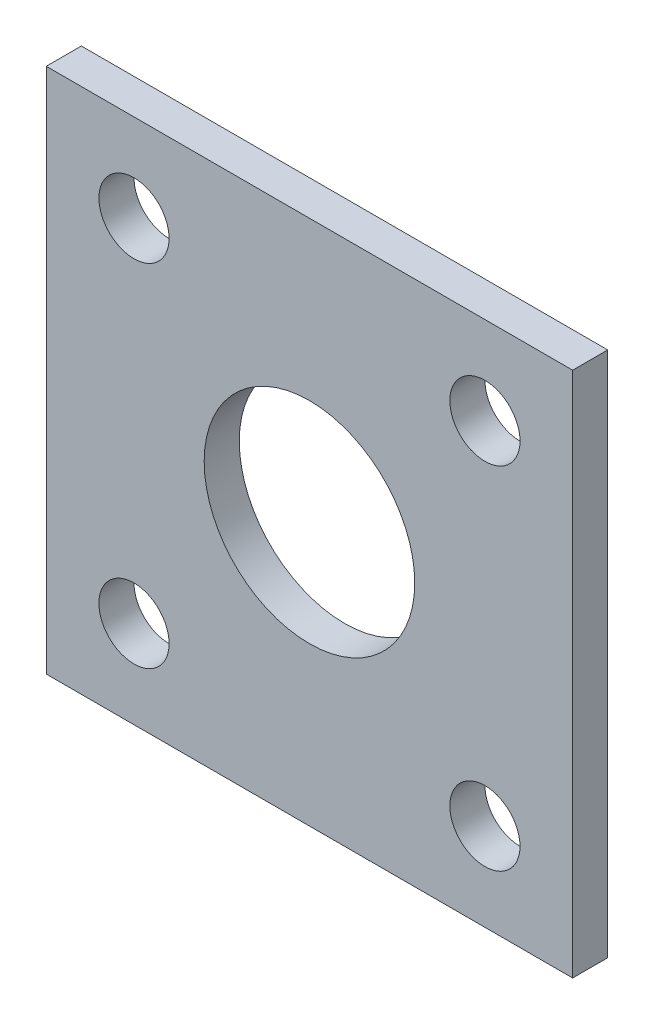
ISO-10303-21;
HEADER;
FILE_DESCRIPTION(('STEP AP214'),'2;1');
FILE_NAME('part.step','',(''),(''),'','','');
FILE_SCHEMA(('AUTOMOTIVE_DESIGN { 1 0 10303 214 1 1 1 1 }'));
ENDSEC;
DATA;
#1=APPLICATION_CONTEXT('core data for automotive mechanical design processes');
#2=APPLICATION_PROTOCOL_DEFINITION('international standard','automotive_design',2000,#1);
#3=PRODUCT_CONTEXT('',#1,'mechanical');
#4=PRODUCT('Part','Part','',(#3));
#5=PRODUCT_RELATED_PRODUCT_CATEGORY('part','',(#4));
#6=PRODUCT_DEFINITION_FORMATION('','',#4);
#7=PRODUCT_DEFINITION_CONTEXT('part definition',#1,'design');
#8=PRODUCT_DEFINITION('design','',#6,#7);
#9=PRODUCT_DEFINITION_SHAPE('','',#8);
#10=(LENGTH_UNIT() NAMED_UNIT(*) SI_UNIT(.MILLI.,.METRE.));
#11=(NAMED_UNIT(*) PLANE_ANGLE_UNIT() SI_UNIT($,.RADIAN.));
#12=(NAMED_UNIT(*) SI_UNIT($,.STERADIAN.) SOLID_ANGLE_UNIT());
#13=UNCERTAINTY_MEASURE_WITH_UNIT(LENGTH_MEASURE(1.E-05),#10,'distance_accuracy_value','');
#14=(GEOMETRIC_REPRESENTATION_CONTEXT(3) GLOBAL_UNCERTAINTY_ASSIGNED_CONTEXT((#13)) GLOBAL_UNIT_ASSIGNED_CONTEXT((#10,
#11,#12)) REPRESENTATION_CONTEXT('',''));
#15=CARTESIAN_POINT('',(0.,0.,0.));
#16=DIRECTION('',(0.,0.,1.));
#17=DIRECTION('',(1.,0.,0.));
#18=AXIS2_PLACEMENT_3D('',#15,#16,#17);
#19=CARTESIAN_POINT('',(0.,0.,100.));
#20=DIRECTION('',(0.,0.,1.));
#21=DIRECTION('',(1.,0.,0.));
#22=AXIS2_PLACEMENT_3D('',#19,#20,#21);
#23=PLANE('',#22);
#24=CARTESIAN_POINT('',(500.,-500.,100.));
#25=DIRECTION('',(0.,0.,1.));
#26=DIRECTION('',(1.,0.,0.));
#27=AXIS2_PLACEMENT_3D('',#24,#25,#26);
#28=CIRCLE('',#27,100.);
#29=CARTESIAN_POINT('',(600.,-500.,100.));
#30=VERTEX_POINT('',#29);
#31=EDGE_CURVE('E127',#30,#30,#28,.T.);
#32=ORIENTED_EDGE('',*,*,#31,.F.);
#33=EDGE_LOOP('',(#32));
#34=FACE_BOUND('',#33,.T.);
#35=CARTESIAN_POINT('',(-500.,500.,100.));
#36=DIRECTION('',(0.,0.,1.));
#37=DIRECTION('',(1.,0.,0.));
#38=AXIS2_PLACEMENT_3D('',#35,#36,#37);
#39=CIRCLE('',#38,100.);
#40=CARTESIAN_POINT('',(-400.,500.,100.));
#41=VERTEX_POINT('',#40);
#42=EDGE_CURVE('E115',#41,#41,#39,.T.);
#43=ORIENTED_EDGE('',*,*,#42,.F.);
#44=EDGE_LOOP('',(#43));
#45=FACE_BOUND('',#44,.T.);
#46=DIRECTION('',(0.,1.,0.));
#47=VECTOR('',#46,1.);
#48=CARTESIAN_POINT('',(750.,750.,100.));
#49=LINE('',#48,#47);
#50=CARTESIAN_POINT('',(750.,-750.,100.));
#51=VERTEX_POINT('',#50);
#52=CARTESIAN_POINT('',(750.,750.,100.));
#53=VERTEX_POINT('',#52);
#54=EDGE_CURVE('E85',#51,#53,#49,.T.);
#55=ORIENTED_EDGE('',*,*,#54,.T.);
#56=DIRECTION('',(-1.,0.,0.));
#57=VECTOR('',#56,1.);
#58=CARTESIAN_POINT('',(-750.,750.,100.));
#59=LINE('',#58,#57);
#60=CARTESIAN_POINT('',(-750.,750.,100.));
#61=VERTEX_POINT('',#60);
#62=EDGE_CURVE('E80',#53,#61,#59,.T.);
#63=ORIENTED_EDGE('',*,*,#62,.T.);
#64=DIRECTION('',(0.,-1.,0.));
#65=VECTOR('',#64,1.);
#66=CARTESIAN_POINT('',(-750.,750.,100.));
#67=LINE('',#66,#65);
#68=CARTESIAN_POINT('',(-750.,-750.,100.));
#69=VERTEX_POINT('',#68);
#70=EDGE_CURVE('E83',#61,#69,#67,.T.);
#71=ORIENTED_EDGE('',*,*,#70,.T.);
#72=DIRECTION('',(1.,0.,0.));
#73=VECTOR('',#72,1.);
#74=CARTESIAN_POINT('',(-750.,-750.,100.));
#75=LINE('',#74,#73);
#76=EDGE_CURVE('E50',#69,#51,#75,.T.);
#77=ORIENTED_EDGE('',*,*,#76,.T.);
#78=EDGE_LOOP('',(#55,#63,#71,#77));
#79=FACE_BOUND('',#78,.T.);
#80=CARTESIAN_POINT('',(0.,0.,100.));
#81=DIRECTION('',(0.,0.,1.));
#82=DIRECTION('',(1.,0.,0.));
#83=AXIS2_PLACEMENT_3D('',#80,#81,#82);
#84=CIRCLE('',#83,300.);
#85=CARTESIAN_POINT('',(300.,0.,100.));
#86=VERTEX_POINT('',#85);
#87=EDGE_CURVE('E100',#86,#86,#84,.T.);
#88=ORIENTED_EDGE('',*,*,#87,.F.);
#89=EDGE_LOOP('',(#88));
#90=FACE_BOUND('',#89,.T.);
#91=CARTESIAN_POINT('',(500.,500.,100.));
#92=DIRECTION('',(0.,0.,1.));
#93=DIRECTION('',(1.,0.,0.));
#94=AXIS2_PLACEMENT_3D('',#91,#92,#93);
#95=CIRCLE('',#94,100.);
#96=CARTESIAN_POINT('',(600.,500.,100.));
#97=VERTEX_POINT('',#96);
#98=EDGE_CURVE('E121',#97,#97,#95,.T.);
#99=ORIENTED_EDGE('',*,*,#98,.F.);
#100=EDGE_LOOP('',(#99));
#101=FACE_BOUND('',#100,.T.);
#102=CARTESIAN_POINT('',(-500.,-500.,100.));
#103=DIRECTION('',(0.,0.,1.));
#104=DIRECTION('',(1.,0.,0.));
#105=AXIS2_PLACEMENT_3D('',#102,#103,#104);
#106=CIRCLE('',#105,100.);
#107=CARTESIAN_POINT('',(-400.,-500.,100.));
#108=VERTEX_POINT('',#107);
#109=EDGE_CURVE('E133',#108,#108,#106,.T.);
#110=ORIENTED_EDGE('',*,*,#109,.F.);
#111=EDGE_LOOP('',(#110));
#112=FACE_BOUND('',#111,.T.);
#113=ADVANCED_FACE('F33',(#34,#45,#79,#90,#101,#112),#23,.T.);
#114=CARTESIAN_POINT('',(0.,0.,0.));
#115=DIRECTION('',(0.,0.,1.));
#116=DIRECTION('',(1.,0.,0.));
#117=AXIS2_PLACEMENT_3D('',#114,#115,#116);
#118=PLANE('',#117);
#119=DIRECTION('',(0.,1.,0.));
#120=VECTOR('',#119,1.);
#121=CARTESIAN_POINT('',(750.,750.,0.));
#122=LINE('',#121,#120);
#123=CARTESIAN_POINT('',(750.,-750.,0.));
#124=VERTEX_POINT('',#123);
#125=CARTESIAN_POINT('',(750.,750.,0.));
#126=VERTEX_POINT('',#125);
#127=EDGE_CURVE('E97',#124,#126,#122,.T.);
#128=ORIENTED_EDGE('',*,*,#127,.F.);
#129=DIRECTION('',(1.,0.,0.));
#130=VECTOR('',#129,1.);
#131=CARTESIAN_POINT('',(-750.,-750.,0.));
#132=LINE('',#131,#130);
#133=CARTESIAN_POINT('',(-750.,-750.,0.));
#134=VERTEX_POINT('',#133);
#135=EDGE_CURVE('E73',#134,#124,#132,.T.);
#136=ORIENTED_EDGE('',*,*,#135,.F.);
#137=DIRECTION('',(0.,-1.,0.));
#138=VECTOR('',#137,1.);
#139=CARTESIAN_POINT('',(-750.,750.,0.));
#140=LINE('',#139,#138);
#141=CARTESIAN_POINT('',(-750.,750.,0.));
#142=VERTEX_POINT('',#141);
#143=EDGE_CURVE('E67',#142,#134,#140,.T.);
#144=ORIENTED_EDGE('',*,*,#143,.F.);
#145=DIRECTION('',(-1.,0.,0.));
#146=VECTOR('',#145,1.);
#147=CARTESIAN_POINT('',(-750.,750.,0.));
#148=LINE('',#147,#146);
#149=EDGE_CURVE('E89',#126,#142,#148,.T.);
#150=ORIENTED_EDGE('',*,*,#149,.F.);
#151=EDGE_LOOP('',(#128,#136,#144,#150));
#152=FACE_BOUND('',#151,.T.);
#153=CARTESIAN_POINT('',(0.,0.,0.));
#154=DIRECTION('',(0.,0.,1.));
#155=DIRECTION('',(1.,0.,0.));
#156=AXIS2_PLACEMENT_3D('',#153,#154,#155);
#157=CIRCLE('',#156,300.);
#158=CARTESIAN_POINT('',(300.,0.,0.));
#159=VERTEX_POINT('',#158);
#160=EDGE_CURVE('E112',#159,#159,#157,.T.);
#161=ORIENTED_EDGE('',*,*,#160,.T.);
#162=EDGE_LOOP('',(#161));
#163=FACE_BOUND('',#162,.T.);
#164=CARTESIAN_POINT('',(-500.,500.,0.));
#165=DIRECTION('',(0.,0.,1.));
#166=DIRECTION('',(1.,0.,0.));
#167=AXIS2_PLACEMENT_3D('',#164,#165,#166);
#168=CIRCLE('',#167,100.);
#169=CARTESIAN_POINT('',(-400.,500.,0.));
#170=VERTEX_POINT('',#169);
#171=EDGE_CURVE('E118',#170,#170,#168,.T.);
#172=ORIENTED_EDGE('',*,*,#171,.T.);
#173=EDGE_LOOP('',(#172));
#174=FACE_BOUND('',#173,.T.);
#175=CARTESIAN_POINT('',(500.,500.,0.));
#176=DIRECTION('',(0.,0.,1.));
#177=DIRECTION('',(1.,0.,0.));
#178=AXIS2_PLACEMENT_3D('',#175,#176,#177);
#179=CIRCLE('',#178,100.);
#180=CARTESIAN_POINT('',(600.,500.,0.));
#181=VERTEX_POINT('',#180);
#182=EDGE_CURVE('E124',#181,#181,#179,.T.);
#183=ORIENTED_EDGE('',*,*,#182,.T.);
#184=EDGE_LOOP('',(#183));
#185=FACE_BOUND('',#184,.T.);
#186=CARTESIAN_POINT('',(500.,-500.,0.));
#187=DIRECTION('',(0.,0.,1.));
#188=DIRECTION('',(1.,0.,0.));
#189=AXIS2_PLACEMENT_3D('',#186,#187,#188);
#190=CIRCLE('',#189,100.);
#191=CARTESIAN_POINT('',(600.,-500.,0.));
#192=VERTEX_POINT('',#191);
#193=EDGE_CURVE('E130',#192,#192,#190,.T.);
#194=ORIENTED_EDGE('',*,*,#193,.T.);
#195=EDGE_LOOP('',(#194));
#196=FACE_BOUND('',#195,.T.);
#197=CARTESIAN_POINT('',(-500.,-500.,0.));
#198=DIRECTION('',(0.,0.,1.));
#199=DIRECTION('',(1.,0.,0.));
#200=AXIS2_PLACEMENT_3D('',#197,#198,#199);
#201=CIRCLE('',#200,100.);
#202=CARTESIAN_POINT('',(-400.,-500.,0.));
#203=VERTEX_POINT('',#202);
#204=EDGE_CURVE('E136',#203,#203,#201,.T.);
#205=ORIENTED_EDGE('',*,*,#204,.T.);
#206=EDGE_LOOP('',(#205));
#207=FACE_BOUND('',#206,.T.);
#208=ADVANCED_FACE('F108',(#152,#163,#174,#185,#196,#207),#118,.F.);
#209=CARTESIAN_POINT('',(750.,750.,100.));
#210=DIRECTION('',(-1.,0.,0.));
#211=DIRECTION('',(0.,-1.,0.));
#212=AXIS2_PLACEMENT_3D('',#209,#210,#211);
#213=PLANE('',#212);
#214=ORIENTED_EDGE('',*,*,#127,.T.);
#215=DIRECTION('',(0.,0.,-1.));
#216=VECTOR('',#215,1.);
#217=CARTESIAN_POINT('',(750.,750.,100.));
#218=LINE('',#217,#216);
#219=EDGE_CURVE('E11',#53,#126,#218,.T.);
#220=ORIENTED_EDGE('',*,*,#219,.F.);
#221=ORIENTED_EDGE('',*,*,#54,.F.);
#222=DIRECTION('',(0.,0.,-1.));
#223=VECTOR('',#222,1.);
#224=CARTESIAN_POINT('',(750.,-750.,100.));
#225=LINE('',#224,#223);
#226=EDGE_CURVE('E93',#51,#124,#225,.T.);
#227=ORIENTED_EDGE('',*,*,#226,.T.);
#228=EDGE_LOOP('',(#214,#220,#221,#227));
#229=FACE_BOUND('',#228,.T.);
#230=ADVANCED_FACE('F35',(#229),#213,.F.);
#231=CARTESIAN_POINT('',(-750.,750.,100.));
#232=DIRECTION('',(0.,-1.,0.));
#233=DIRECTION('',(0.,0.,-1.));
#234=AXIS2_PLACEMENT_3D('',#231,#232,#233);
#235=PLANE('',#234);
#236=ORIENTED_EDGE('',*,*,#149,.T.);
#237=DIRECTION('',(0.,0.,-1.));
#238=VECTOR('',#237,1.);
#239=CARTESIAN_POINT('',(-750.,750.,100.));
#240=LINE('',#239,#238);
#241=EDGE_CURVE('E42',#61,#142,#240,.T.);
#242=ORIENTED_EDGE('',*,*,#241,.F.);
#243=ORIENTED_EDGE('',*,*,#62,.F.);
#244=ORIENTED_EDGE('',*,*,#219,.T.);
#245=EDGE_LOOP('',(#236,#242,#243,#244));
#246=FACE_BOUND('',#245,.T.);
#247=ADVANCED_FACE('F88',(#246),#235,.F.);
#248=CARTESIAN_POINT('',(-750.,750.,100.));
#249=DIRECTION('',(1.,0.,0.));
#250=DIRECTION('',(0.,1.,0.));
#251=AXIS2_PLACEMENT_3D('',#248,#249,#250);
#252=PLANE('',#251);
#253=ORIENTED_EDGE('',*,*,#143,.T.);
#254=DIRECTION('',(0.,0.,-1.));
#255=VECTOR('',#254,1.);
#256=CARTESIAN_POINT('',(-750.,-750.,100.));
#257=LINE('',#256,#255);
#258=EDGE_CURVE('E90',#69,#134,#257,.T.);
#259=ORIENTED_EDGE('',*,*,#258,.F.);
#260=ORIENTED_EDGE('',*,*,#70,.F.);
#261=ORIENTED_EDGE('',*,*,#241,.T.);
#262=EDGE_LOOP('',(#253,#259,#260,#261));
#263=FACE_BOUND('',#262,.T.);
#264=ADVANCED_FACE('F91',(#263),#252,.F.);
#265=CARTESIAN_POINT('',(-750.,-750.,100.));
#266=DIRECTION('',(0.,1.,0.));
#267=DIRECTION('',(0.,0.,1.));
#268=AXIS2_PLACEMENT_3D('',#265,#266,#267);
#269=PLANE('',#268);
#270=ORIENTED_EDGE('',*,*,#135,.T.);
#271=ORIENTED_EDGE('',*,*,#226,.F.);
#272=ORIENTED_EDGE('',*,*,#76,.F.);
#273=ORIENTED_EDGE('',*,*,#258,.T.);
#274=EDGE_LOOP('',(#270,#271,#272,#273));
#275=FACE_BOUND('',#274,.T.);
#276=ADVANCED_FACE('F105',(#275),#269,.F.);
#277=CARTESIAN_POINT('',(0.,0.,100.));
#278=DIRECTION('',(0.,0.,-1.));
#279=DIRECTION('',(-1.,0.,0.));
#280=AXIS2_PLACEMENT_3D('',#277,#278,#279);
#281=CYLINDRICAL_SURFACE('',#280,300.);
#282=ORIENTED_EDGE('',*,*,#87,.T.);
#283=EDGE_LOOP('',(#282));
#284=FACE_BOUND('',#283,.T.);
#285=ORIENTED_EDGE('',*,*,#160,.F.);
#286=EDGE_LOOP('',(#285));
#287=FACE_BOUND('',#286,.T.);
#288=ADVANCED_FACE('F155',(#284,#287),#281,.F.);
#289=CARTESIAN_POINT('',(-500.,500.,100.));
#290=DIRECTION('',(0.,0.,-1.));
#291=DIRECTION('',(-1.,0.,0.));
#292=AXIS2_PLACEMENT_3D('',#289,#290,#291);
#293=CYLINDRICAL_SURFACE('',#292,100.);
#294=ORIENTED_EDGE('',*,*,#42,.T.);
#295=EDGE_LOOP('',(#294));
#296=FACE_BOUND('',#295,.T.);
#297=ORIENTED_EDGE('',*,*,#171,.F.);
#298=EDGE_LOOP('',(#297));
#299=FACE_BOUND('',#298,.T.);
#300=ADVANCED_FACE('F201',(#296,#299),#293,.F.);
#301=CARTESIAN_POINT('',(500.,500.,100.));
#302=DIRECTION('',(0.,0.,-1.));
#303=DIRECTION('',(-1.,0.,0.));
#304=AXIS2_PLACEMENT_3D('',#301,#302,#303);
#305=CYLINDRICAL_SURFACE('',#304,100.);
#306=ORIENTED_EDGE('',*,*,#98,.T.);
#307=EDGE_LOOP('',(#306));
#308=FACE_BOUND('',#307,.T.);
#309=ORIENTED_EDGE('',*,*,#182,.F.);
#310=EDGE_LOOP('',(#309));
#311=FACE_BOUND('',#310,.T.);
#312=ADVANCED_FACE('F209',(#308,#311),#305,.F.);
#313=CARTESIAN_POINT('',(500.,-500.,100.));
#314=DIRECTION('',(0.,0.,-1.));
#315=DIRECTION('',(-1.,0.,0.));
#316=AXIS2_PLACEMENT_3D('',#313,#314,#315);
#317=CYLINDRICAL_SURFACE('',#316,100.);
#318=ORIENTED_EDGE('',*,*,#31,.T.);
#319=EDGE_LOOP('',(#318));
#320=FACE_BOUND('',#319,.T.);
#321=ORIENTED_EDGE('',*,*,#193,.F.);
#322=EDGE_LOOP('',(#321));
#323=FACE_BOUND('',#322,.T.);
#324=ADVANCED_FACE('F217',(#320,#323),#317,.F.);
#325=CARTESIAN_POINT('',(-500.,-500.,100.));
#326=DIRECTION('',(0.,0.,-1.));
#327=DIRECTION('',(-1.,0.,0.));
#328=AXIS2_PLACEMENT_3D('',#325,#326,#327);
#329=CYLINDRICAL_SURFACE('',#328,100.);
#330=ORIENTED_EDGE('',*,*,#109,.T.);
#331=EDGE_LOOP('',(#330));
#332=FACE_BOUND('',#331,.T.);
#333=ORIENTED_EDGE('',*,*,#204,.F.);
#334=EDGE_LOOP('',(#333));
#335=FACE_BOUND('',#334,.T.);
#336=ADVANCED_FACE('F142',(#332,#335),#329,.F.);
#337=CLOSED_SHELL('',(#113,#208,#230,#247,#264,#276,#288,#300,#312,#324,#336));
#338=MANIFOLD_SOLID_BREP('B2',#337);
#339=ADVANCED_BREP_SHAPE_REPRESENTATION('',(#18,#338),#14);
#340=SHAPE_DEFINITION_REPRESENTATION(#9,#339);
ENDSEC;
END-ISO-10303-21;
